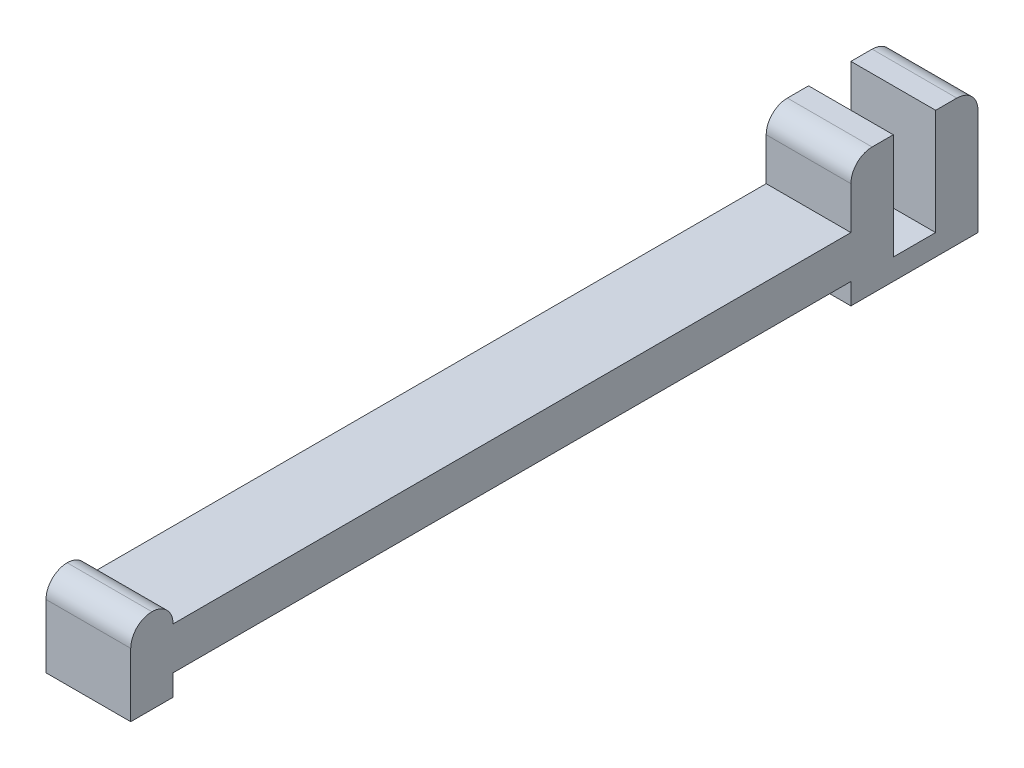
ISO-10303-21;
HEADER;
FILE_DESCRIPTION(('STEP AP214'),'2;1');
FILE_NAME('part.step','',(''),(''),'','','');
FILE_SCHEMA(('AUTOMOTIVE_DESIGN { 1 0 10303 214 1 1 1 1 }'));
ENDSEC;
DATA;
#1=APPLICATION_CONTEXT('core data for automotive mechanical design processes');
#2=APPLICATION_PROTOCOL_DEFINITION('international standard','automotive_design',2000,#1);
#3=PRODUCT_CONTEXT('',#1,'mechanical');
#4=PRODUCT('Part','Part','',(#3));
#5=PRODUCT_RELATED_PRODUCT_CATEGORY('part','',(#4));
#6=PRODUCT_DEFINITION_FORMATION('','',#4);
#7=PRODUCT_DEFINITION_CONTEXT('part definition',#1,'design');
#8=PRODUCT_DEFINITION('design','',#6,#7);
#9=PRODUCT_DEFINITION_SHAPE('','',#8);
#10=(LENGTH_UNIT() NAMED_UNIT(*) SI_UNIT(.MILLI.,.METRE.));
#11=(NAMED_UNIT(*) PLANE_ANGLE_UNIT() SI_UNIT($,.RADIAN.));
#12=(NAMED_UNIT(*) SI_UNIT($,.STERADIAN.) SOLID_ANGLE_UNIT());
#13=UNCERTAINTY_MEASURE_WITH_UNIT(LENGTH_MEASURE(1.E-05),#10,'distance_accuracy_value','');
#14=(GEOMETRIC_REPRESENTATION_CONTEXT(3) GLOBAL_UNCERTAINTY_ASSIGNED_CONTEXT((#13)) GLOBAL_UNIT_ASSIGNED_CONTEXT((#10,
#11,#12)) REPRESENTATION_CONTEXT('',''));
#15=CARTESIAN_POINT('',(0.,0.,0.));
#16=DIRECTION('',(0.,0.,1.));
#17=DIRECTION('',(1.,0.,0.));
#18=AXIS2_PLACEMENT_3D('',#15,#16,#17);
#19=CARTESIAN_POINT('',(40.,10.,-160.));
#20=DIRECTION('',(0.,-1.,0.));
#21=DIRECTION('',(0.,0.,-1.));
#22=AXIS2_PLACEMENT_3D('',#19,#20,#21);
#23=PLANE('',#22);
#24=DIRECTION('',(0.,0.,1.));
#25=VECTOR('',#24,1.);
#26=CARTESIAN_POINT('',(0.,10.,-160.));
#27=LINE('',#26,#25);
#28=CARTESIAN_POINT('',(0.,10.,-160.));
#29=VERTEX_POINT('',#28);
#30=CARTESIAN_POINT('',(0.,9.99999999999998,160.));
#31=VERTEX_POINT('',#30);
#32=EDGE_CURVE('E188',#29,#31,#27,.T.);
#33=ORIENTED_EDGE('',*,*,#32,.T.);
#34=DIRECTION('',(-1.,0.,0.));
#35=VECTOR('',#34,1.);
#36=CARTESIAN_POINT('',(40.,9.99999999999998,160.));
#37=LINE('',#36,#35);
#38=CARTESIAN_POINT('',(40.,9.99999999999998,160.));
#39=VERTEX_POINT('',#38);
#40=EDGE_CURVE('E186',#39,#31,#37,.T.);
#41=ORIENTED_EDGE('',*,*,#40,.F.);
#42=DIRECTION('',(0.,0.,1.));
#43=VECTOR('',#42,1.);
#44=CARTESIAN_POINT('',(40.,10.,-160.));
#45=LINE('',#44,#43);
#46=CARTESIAN_POINT('',(40.,10.,-160.));
#47=VERTEX_POINT('',#46);
#48=EDGE_CURVE('E168',#47,#39,#45,.T.);
#49=ORIENTED_EDGE('',*,*,#48,.F.);
#50=DIRECTION('',(-1.,0.,0.));
#51=VECTOR('',#50,1.);
#52=CARTESIAN_POINT('',(40.,10.,-160.));
#53=LINE('',#52,#51);
#54=EDGE_CURVE('E269',#47,#29,#53,.T.);
#55=ORIENTED_EDGE('',*,*,#54,.T.);
#56=EDGE_LOOP('',(#33,#41,#49,#55));
#57=FACE_BOUND('',#56,.T.);
#58=ADVANCED_FACE('F44',(#57),#23,.F.);
#59=CARTESIAN_POINT('',(40.,20.,180.));
#60=DIRECTION('',(0.,0.,-1.));
#61=DIRECTION('',(-1.,0.,0.));
#62=AXIS2_PLACEMENT_3D('',#59,#60,#61);
#63=PLANE('',#62);
#64=DIRECTION('',(0.,-1.,0.));
#65=VECTOR('',#64,1.);
#66=CARTESIAN_POINT('',(40.,20.,180.));
#67=LINE('',#66,#65);
#68=CARTESIAN_POINT('',(40.,9.99999999999998,180.));
#69=VERTEX_POINT('',#68);
#70=CARTESIAN_POINT('',(40.,-20.,180.));
#71=VERTEX_POINT('',#70);
#72=EDGE_CURVE('E181',#69,#71,#67,.T.);
#73=ORIENTED_EDGE('',*,*,#72,.F.);
#74=DIRECTION('',(-1.,0.,0.));
#75=VECTOR('',#74,1.);
#76=CARTESIAN_POINT('',(40.,9.99999999999998,180.));
#77=LINE('',#76,#75);
#78=CARTESIAN_POINT('',(0.,9.99999999999998,180.));
#79=VERTEX_POINT('',#78);
#80=EDGE_CURVE('E192',#69,#79,#77,.T.);
#81=ORIENTED_EDGE('',*,*,#80,.T.);
#82=DIRECTION('',(0.,-1.,0.));
#83=VECTOR('',#82,1.);
#84=CARTESIAN_POINT('',(0.,20.,180.));
#85=LINE('',#84,#83);
#86=CARTESIAN_POINT('',(0.,-20.,180.));
#87=VERTEX_POINT('',#86);
#88=EDGE_CURVE('E361',#79,#87,#85,.T.);
#89=ORIENTED_EDGE('',*,*,#88,.T.);
#90=DIRECTION('',(-1.,0.,0.));
#91=VECTOR('',#90,1.);
#92=CARTESIAN_POINT('',(40.,-20.,180.));
#93=LINE('',#92,#91);
#94=EDGE_CURVE('E193',#71,#87,#93,.T.);
#95=ORIENTED_EDGE('',*,*,#94,.F.);
#96=EDGE_LOOP('',(#73,#81,#89,#95));
#97=FACE_BOUND('',#96,.T.);
#98=ADVANCED_FACE('F320',(#97),#63,.F.);
#99=CARTESIAN_POINT('',(40.,-20.,180.));
#100=DIRECTION('',(0.,1.,0.));
#101=DIRECTION('',(0.,0.,1.));
#102=AXIS2_PLACEMENT_3D('',#99,#100,#101);
#103=PLANE('',#102);
#104=DIRECTION('',(0.,0.,-1.));
#105=VECTOR('',#104,1.);
#106=CARTESIAN_POINT('',(0.,-20.,180.));
#107=LINE('',#106,#105);
#108=CARTESIAN_POINT('',(0.,-20.,160.));
#109=VERTEX_POINT('',#108);
#110=EDGE_CURVE('E364',#87,#109,#107,.T.);
#111=ORIENTED_EDGE('',*,*,#110,.T.);
#112=DIRECTION('',(-1.,0.,0.));
#113=VECTOR('',#112,1.);
#114=CARTESIAN_POINT('',(40.,-20.,160.));
#115=LINE('',#114,#113);
#116=CARTESIAN_POINT('',(40.,-20.,160.));
#117=VERTEX_POINT('',#116);
#118=EDGE_CURVE('E303',#117,#109,#115,.T.);
#119=ORIENTED_EDGE('',*,*,#118,.F.);
#120=DIRECTION('',(0.,0.,-1.));
#121=VECTOR('',#120,1.);
#122=CARTESIAN_POINT('',(40.,-20.,180.));
#123=LINE('',#122,#121);
#124=EDGE_CURVE('E323',#71,#117,#123,.T.);
#125=ORIENTED_EDGE('',*,*,#124,.F.);
#126=ORIENTED_EDGE('',*,*,#94,.T.);
#127=EDGE_LOOP('',(#111,#119,#125,#126));
#128=FACE_BOUND('',#127,.T.);
#129=ADVANCED_FACE('F396',(#128),#103,.F.);
#130=CARTESIAN_POINT('',(40.,-20.,160.));
#131=DIRECTION('',(0.,0.,1.));
#132=DIRECTION('',(0.,-1.,0.));
#133=AXIS2_PLACEMENT_3D('',#130,#131,#132);
#134=PLANE('',#133);
#135=DIRECTION('',(0.,1.,0.));
#136=VECTOR('',#135,1.);
#137=CARTESIAN_POINT('',(0.,-20.,160.));
#138=LINE('',#137,#136);
#139=CARTESIAN_POINT('',(0.,-10.,160.));
#140=VERTEX_POINT('',#139);
#141=EDGE_CURVE('E367',#109,#140,#138,.T.);
#142=ORIENTED_EDGE('',*,*,#141,.T.);
#143=DIRECTION('',(-1.,0.,0.));
#144=VECTOR('',#143,1.);
#145=CARTESIAN_POINT('',(40.,-10.,160.));
#146=LINE('',#145,#144);
#147=CARTESIAN_POINT('',(40.,-10.,160.));
#148=VERTEX_POINT('',#147);
#149=EDGE_CURVE('E299',#148,#140,#146,.T.);
#150=ORIENTED_EDGE('',*,*,#149,.F.);
#151=DIRECTION('',(0.,1.,0.));
#152=VECTOR('',#151,1.);
#153=CARTESIAN_POINT('',(40.,-20.,160.));
#154=LINE('',#153,#152);
#155=EDGE_CURVE('E326',#117,#148,#154,.T.);
#156=ORIENTED_EDGE('',*,*,#155,.F.);
#157=ORIENTED_EDGE('',*,*,#118,.T.);
#158=EDGE_LOOP('',(#142,#150,#156,#157));
#159=FACE_BOUND('',#158,.T.);
#160=ADVANCED_FACE('F444',(#159),#134,.F.);
#161=CARTESIAN_POINT('',(40.,-9.99999999999998,-160.));
#162=DIRECTION('',(0.,1.,0.));
#163=DIRECTION('',(0.,0.,1.));
#164=AXIS2_PLACEMENT_3D('',#161,#162,#163);
#165=PLANE('',#164);
#166=DIRECTION('',(0.,0.,-1.));
#167=VECTOR('',#166,1.);
#168=CARTESIAN_POINT('',(0.,-9.99999999999998,-160.));
#169=LINE('',#168,#167);
#170=CARTESIAN_POINT('',(0.,-9.99999999999998,-160.));
#171=VERTEX_POINT('',#170);
#172=EDGE_CURVE('E370',#140,#171,#169,.T.);
#173=ORIENTED_EDGE('',*,*,#172,.T.);
#174=DIRECTION('',(-1.,0.,0.));
#175=VECTOR('',#174,1.);
#176=CARTESIAN_POINT('',(40.,-9.99999999999998,-160.));
#177=LINE('',#176,#175);
#178=CARTESIAN_POINT('',(40.,-9.99999999999998,-160.));
#179=VERTEX_POINT('',#178);
#180=EDGE_CURVE('E295',#179,#171,#177,.T.);
#181=ORIENTED_EDGE('',*,*,#180,.F.);
#182=DIRECTION('',(0.,0.,-1.));
#183=VECTOR('',#182,1.);
#184=CARTESIAN_POINT('',(40.,-9.99999999999998,-160.));
#185=LINE('',#184,#183);
#186=EDGE_CURVE('E331',#148,#179,#185,.T.);
#187=ORIENTED_EDGE('',*,*,#186,.F.);
#188=ORIENTED_EDGE('',*,*,#149,.T.);
#189=EDGE_LOOP('',(#173,#181,#187,#188));
#190=FACE_BOUND('',#189,.T.);
#191=ADVANCED_FACE('F440',(#190),#165,.F.);
#192=CARTESIAN_POINT('',(40.,-20.,-160.));
#193=DIRECTION('',(0.,0.,-1.));
#194=DIRECTION('',(-1.,0.,0.));
#195=AXIS2_PLACEMENT_3D('',#192,#193,#194);
#196=PLANE('',#195);
#197=DIRECTION('',(0.,-1.,0.));
#198=VECTOR('',#197,1.);
#199=CARTESIAN_POINT('',(0.,-20.,-160.));
#200=LINE('',#199,#198);
#201=CARTESIAN_POINT('',(0.,-20.,-160.));
#202=VERTEX_POINT('',#201);
#203=EDGE_CURVE('E373',#171,#202,#200,.T.);
#204=ORIENTED_EDGE('',*,*,#203,.T.);
#205=DIRECTION('',(-1.,0.,0.));
#206=VECTOR('',#205,1.);
#207=CARTESIAN_POINT('',(40.,-20.,-160.));
#208=LINE('',#207,#206);
#209=CARTESIAN_POINT('',(40.,-20.,-160.));
#210=VERTEX_POINT('',#209);
#211=EDGE_CURVE('E291',#210,#202,#208,.T.);
#212=ORIENTED_EDGE('',*,*,#211,.F.);
#213=DIRECTION('',(0.,-1.,0.));
#214=VECTOR('',#213,1.);
#215=CARTESIAN_POINT('',(40.,-20.,-160.));
#216=LINE('',#215,#214);
#217=EDGE_CURVE('E334',#179,#210,#216,.T.);
#218=ORIENTED_EDGE('',*,*,#217,.F.);
#219=ORIENTED_EDGE('',*,*,#180,.T.);
#220=EDGE_LOOP('',(#204,#212,#218,#219));
#221=FACE_BOUND('',#220,.T.);
#222=ADVANCED_FACE('F437',(#221),#196,.F.);
#223=CARTESIAN_POINT('',(40.,-20.,-180.));
#224=DIRECTION('',(0.,1.,0.));
#225=DIRECTION('',(0.,0.,1.));
#226=AXIS2_PLACEMENT_3D('',#223,#224,#225);
#227=PLANE('',#226);
#228=DIRECTION('',(0.,0.,-1.));
#229=VECTOR('',#228,1.);
#230=CARTESIAN_POINT('',(0.,-20.,-180.));
#231=LINE('',#230,#229);
#232=CARTESIAN_POINT('',(0.,-20.,-220.));
#233=VERTEX_POINT('',#232);
#234=EDGE_CURVE('E254',#202,#233,#231,.T.);
#235=ORIENTED_EDGE('',*,*,#234,.T.);
#236=DIRECTION('',(-1.,0.,0.));
#237=VECTOR('',#236,1.);
#238=CARTESIAN_POINT('',(40.,-20.,-220.));
#239=LINE('',#238,#237);
#240=CARTESIAN_POINT('',(40.,-20.,-220.));
#241=VERTEX_POINT('',#240);
#242=EDGE_CURVE('E287',#241,#233,#239,.T.);
#243=ORIENTED_EDGE('',*,*,#242,.F.);
#244=DIRECTION('',(0.,0.,-1.));
#245=VECTOR('',#244,1.);
#246=CARTESIAN_POINT('',(40.,-20.,-180.));
#247=LINE('',#246,#245);
#248=EDGE_CURVE('E337',#210,#241,#247,.T.);
#249=ORIENTED_EDGE('',*,*,#248,.F.);
#250=ORIENTED_EDGE('',*,*,#211,.T.);
#251=EDGE_LOOP('',(#235,#243,#249,#250));
#252=FACE_BOUND('',#251,.T.);
#253=ADVANCED_FACE('F379',(#252),#227,.F.);
#254=CARTESIAN_POINT('',(40.,-20.,-220.));
#255=DIRECTION('',(0.,0.,1.));
#256=DIRECTION('',(1.,0.,0.));
#257=AXIS2_PLACEMENT_3D('',#254,#255,#256);
#258=PLANE('',#257);
#259=DIRECTION('',(0.,1.,0.));
#260=VECTOR('',#259,1.);
#261=CARTESIAN_POINT('',(0.,-20.,-220.));
#262=LINE('',#261,#260);
#263=CARTESIAN_POINT('',(0.,30.,-220.));
#264=VERTEX_POINT('',#263);
#265=EDGE_CURVE('E248',#233,#264,#262,.T.);
#266=ORIENTED_EDGE('',*,*,#265,.T.);
#267=DIRECTION('',(-1.,0.,0.));
#268=VECTOR('',#267,1.);
#269=CARTESIAN_POINT('',(40.,30.,-220.));
#270=LINE('',#269,#268);
#271=CARTESIAN_POINT('',(40.,30.,-220.));
#272=VERTEX_POINT('',#271);
#273=EDGE_CURVE('E11',#264,#272,#270,.F.);
#274=ORIENTED_EDGE('',*,*,#273,.T.);
#275=DIRECTION('',(0.,1.,0.));
#276=VECTOR('',#275,1.);
#277=CARTESIAN_POINT('',(40.,-20.,-220.));
#278=LINE('',#277,#276);
#279=EDGE_CURVE('E340',#241,#272,#278,.T.);
#280=ORIENTED_EDGE('',*,*,#279,.F.);
#281=ORIENTED_EDGE('',*,*,#242,.T.);
#282=EDGE_LOOP('',(#266,#274,#280,#281));
#283=FACE_BOUND('',#282,.T.);
#284=ADVANCED_FACE('F383',(#283),#258,.F.);
#285=CARTESIAN_POINT('',(40.,40.,-200.));
#286=DIRECTION('',(0.,-1.,0.));
#287=DIRECTION('',(0.,0.,-1.));
#288=AXIS2_PLACEMENT_3D('',#285,#286,#287);
#289=PLANE('',#288);
#290=DIRECTION('',(0.,0.,1.));
#291=VECTOR('',#290,1.);
#292=CARTESIAN_POINT('',(40.,40.,-200.));
#293=LINE('',#292,#291);
#294=CARTESIAN_POINT('',(40.,40.,-210.));
#295=VERTEX_POINT('',#294);
#296=CARTESIAN_POINT('',(40.,40.,-200.));
#297=VERTEX_POINT('',#296);
#298=EDGE_CURVE('E238',#295,#297,#293,.T.);
#299=ORIENTED_EDGE('',*,*,#298,.F.);
#300=DIRECTION('',(-1.,0.,0.));
#301=VECTOR('',#300,1.);
#302=CARTESIAN_POINT('',(40.,40.,-210.));
#303=LINE('',#302,#301);
#304=CARTESIAN_POINT('',(0.,40.,-210.));
#305=VERTEX_POINT('',#304);
#306=EDGE_CURVE('E53',#295,#305,#303,.T.);
#307=ORIENTED_EDGE('',*,*,#306,.T.);
#308=DIRECTION('',(0.,0.,1.));
#309=VECTOR('',#308,1.);
#310=CARTESIAN_POINT('',(0.,40.,-200.));
#311=LINE('',#310,#309);
#312=CARTESIAN_POINT('',(0.,40.,-200.));
#313=VERTEX_POINT('',#312);
#314=EDGE_CURVE('E236',#305,#313,#311,.T.);
#315=ORIENTED_EDGE('',*,*,#314,.T.);
#316=DIRECTION('',(-1.,0.,0.));
#317=VECTOR('',#316,1.);
#318=CARTESIAN_POINT('',(40.,40.,-200.));
#319=LINE('',#318,#317);
#320=EDGE_CURVE('E284',#297,#313,#319,.T.);
#321=ORIENTED_EDGE('',*,*,#320,.F.);
#322=EDGE_LOOP('',(#299,#307,#315,#321));
#323=FACE_BOUND('',#322,.T.);
#324=ADVANCED_FACE('F234',(#323),#289,.F.);
#325=CARTESIAN_POINT('',(40.,-9.99999999999998,-200.));
#326=DIRECTION('',(0.,0.,-1.));
#327=DIRECTION('',(-1.,0.,0.));
#328=AXIS2_PLACEMENT_3D('',#325,#326,#327);
#329=PLANE('',#328);
#330=DIRECTION('',(0.,-1.,0.));
#331=VECTOR('',#330,1.);
#332=CARTESIAN_POINT('',(0.,-9.99999999999998,-200.));
#333=LINE('',#332,#331);
#334=CARTESIAN_POINT('',(0.,-9.99999999999998,-200.));
#335=VERTEX_POINT('',#334);
#336=EDGE_CURVE('E246',#313,#335,#333,.T.);
#337=ORIENTED_EDGE('',*,*,#336,.T.);
#338=DIRECTION('',(-1.,0.,0.));
#339=VECTOR('',#338,1.);
#340=CARTESIAN_POINT('',(40.,-9.99999999999998,-200.));
#341=LINE('',#340,#339);
#342=CARTESIAN_POINT('',(40.,-9.99999999999998,-200.));
#343=VERTEX_POINT('',#342);
#344=EDGE_CURVE('E280',#343,#335,#341,.T.);
#345=ORIENTED_EDGE('',*,*,#344,.F.);
#346=DIRECTION('',(0.,-1.,0.));
#347=VECTOR('',#346,1.);
#348=CARTESIAN_POINT('',(40.,-9.99999999999998,-200.));
#349=LINE('',#348,#347);
#350=EDGE_CURVE('E345',#297,#343,#349,.T.);
#351=ORIENTED_EDGE('',*,*,#350,.F.);
#352=ORIENTED_EDGE('',*,*,#320,.T.);
#353=EDGE_LOOP('',(#337,#345,#351,#352));
#354=FACE_BOUND('',#353,.T.);
#355=ADVANCED_FACE('F426',(#354),#329,.F.);
#356=CARTESIAN_POINT('',(40.,-9.99999999999998,-180.));
#357=DIRECTION('',(0.,-1.,0.));
#358=DIRECTION('',(0.,0.,-1.));
#359=AXIS2_PLACEMENT_3D('',#356,#357,#358);
#360=PLANE('',#359);
#361=DIRECTION('',(0.,0.,1.));
#362=VECTOR('',#361,1.);
#363=CARTESIAN_POINT('',(0.,-9.99999999999998,-180.));
#364=LINE('',#363,#362);
#365=CARTESIAN_POINT('',(0.,-9.99999999999998,-180.));
#366=VERTEX_POINT('',#365);
#367=EDGE_CURVE('E252',#335,#366,#364,.T.);
#368=ORIENTED_EDGE('',*,*,#367,.T.);
#369=DIRECTION('',(-1.,0.,0.));
#370=VECTOR('',#369,1.);
#371=CARTESIAN_POINT('',(40.,-9.99999999999998,-180.));
#372=LINE('',#371,#370);
#373=CARTESIAN_POINT('',(40.,-9.99999999999998,-180.));
#374=VERTEX_POINT('',#373);
#375=EDGE_CURVE('E276',#374,#366,#372,.T.);
#376=ORIENTED_EDGE('',*,*,#375,.F.);
#377=DIRECTION('',(0.,0.,1.));
#378=VECTOR('',#377,1.);
#379=CARTESIAN_POINT('',(40.,-9.99999999999998,-180.));
#380=LINE('',#379,#378);
#381=EDGE_CURVE('E348',#343,#374,#380,.T.);
#382=ORIENTED_EDGE('',*,*,#381,.F.);
#383=ORIENTED_EDGE('',*,*,#344,.T.);
#384=EDGE_LOOP('',(#368,#376,#382,#383));
#385=FACE_BOUND('',#384,.T.);
#386=ADVANCED_FACE('F422',(#385),#360,.F.);
#387=CARTESIAN_POINT('',(40.,40.,-180.));
#388=DIRECTION('',(0.,0.,1.));
#389=DIRECTION('',(1.,0.,0.));
#390=AXIS2_PLACEMENT_3D('',#387,#388,#389);
#391=PLANE('',#390);
#392=DIRECTION('',(0.,1.,0.));
#393=VECTOR('',#392,1.);
#394=CARTESIAN_POINT('',(0.,40.,-180.));
#395=LINE('',#394,#393);
#396=CARTESIAN_POINT('',(0.,40.,-180.));
#397=VERTEX_POINT('',#396);
#398=EDGE_CURVE('E260',#366,#397,#395,.T.);
#399=ORIENTED_EDGE('',*,*,#398,.T.);
#400=DIRECTION('',(-1.,0.,0.));
#401=VECTOR('',#400,1.);
#402=CARTESIAN_POINT('',(40.,40.,-180.));
#403=LINE('',#402,#401);
#404=CARTESIAN_POINT('',(40.,40.,-180.));
#405=VERTEX_POINT('',#404);
#406=EDGE_CURVE('E272',#405,#397,#403,.T.);
#407=ORIENTED_EDGE('',*,*,#406,.F.);
#408=DIRECTION('',(0.,1.,0.));
#409=VECTOR('',#408,1.);
#410=CARTESIAN_POINT('',(40.,40.,-180.));
#411=LINE('',#410,#409);
#412=EDGE_CURVE('E351',#374,#405,#411,.T.);
#413=ORIENTED_EDGE('',*,*,#412,.F.);
#414=ORIENTED_EDGE('',*,*,#375,.T.);
#415=EDGE_LOOP('',(#399,#407,#413,#414));
#416=FACE_BOUND('',#415,.T.);
#417=ADVANCED_FACE('F419',(#416),#391,.F.);
#418=CARTESIAN_POINT('',(40.,40.,-160.));
#419=DIRECTION('',(0.,-1.,0.));
#420=DIRECTION('',(0.,0.,-1.));
#421=AXIS2_PLACEMENT_3D('',#418,#419,#420);
#422=PLANE('',#421);
#423=DIRECTION('',(0.,0.,1.));
#424=VECTOR('',#423,1.);
#425=CARTESIAN_POINT('',(0.,40.,-160.));
#426=LINE('',#425,#424);
#427=CARTESIAN_POINT('',(0.,40.,-170.));
#428=VERTEX_POINT('',#427);
#429=EDGE_CURVE('E263',#397,#428,#426,.T.);
#430=ORIENTED_EDGE('',*,*,#429,.T.);
#431=DIRECTION('',(-1.,0.,0.));
#432=VECTOR('',#431,1.);
#433=CARTESIAN_POINT('',(40.,40.,-170.));
#434=LINE('',#433,#432);
#435=CARTESIAN_POINT('',(40.,40.,-170.));
#436=VERTEX_POINT('',#435);
#437=EDGE_CURVE('E222',#428,#436,#434,.F.);
#438=ORIENTED_EDGE('',*,*,#437,.T.);
#439=DIRECTION('',(0.,0.,1.));
#440=VECTOR('',#439,1.);
#441=CARTESIAN_POINT('',(40.,40.,-160.));
#442=LINE('',#441,#440);
#443=EDGE_CURVE('E354',#405,#436,#442,.T.);
#444=ORIENTED_EDGE('',*,*,#443,.F.);
#445=ORIENTED_EDGE('',*,*,#406,.T.);
#446=EDGE_LOOP('',(#430,#438,#444,#445));
#447=FACE_BOUND('',#446,.T.);
#448=ADVANCED_FACE('F415',(#447),#422,.F.);
#449=CARTESIAN_POINT('',(40.,10.,-160.));
#450=DIRECTION('',(0.,0.,-1.));
#451=DIRECTION('',(-1.,0.,0.));
#452=AXIS2_PLACEMENT_3D('',#449,#450,#451);
#453=PLANE('',#452);
#454=DIRECTION('',(0.,-1.,0.));
#455=VECTOR('',#454,1.);
#456=CARTESIAN_POINT('',(40.,10.,-160.));
#457=LINE('',#456,#455);
#458=CARTESIAN_POINT('',(40.,30.,-160.));
#459=VERTEX_POINT('',#458);
#460=EDGE_CURVE('E176',#459,#47,#457,.T.);
#461=ORIENTED_EDGE('',*,*,#460,.F.);
#462=DIRECTION('',(-1.,0.,0.));
#463=VECTOR('',#462,1.);
#464=CARTESIAN_POINT('',(40.,30.,-160.));
#465=LINE('',#464,#463);
#466=CARTESIAN_POINT('',(0.,30.,-160.));
#467=VERTEX_POINT('',#466);
#468=EDGE_CURVE('E205',#459,#467,#465,.T.);
#469=ORIENTED_EDGE('',*,*,#468,.T.);
#470=DIRECTION('',(0.,-1.,0.));
#471=VECTOR('',#470,1.);
#472=CARTESIAN_POINT('',(0.,10.,-160.));
#473=LINE('',#472,#471);
#474=EDGE_CURVE('E182',#467,#29,#473,.T.);
#475=ORIENTED_EDGE('',*,*,#474,.T.);
#476=ORIENTED_EDGE('',*,*,#54,.F.);
#477=EDGE_LOOP('',(#461,#469,#475,#476));
#478=FACE_BOUND('',#477,.T.);
#479=ADVANCED_FACE('F410',(#478),#453,.F.);
#480=CARTESIAN_POINT('',(40.,0.,0.));
#481=DIRECTION('',(-1.,0.,0.));
#482=DIRECTION('',(0.,0.,1.));
#483=AXIS2_PLACEMENT_3D('',#480,#481,#482);
#484=PLANE('',#483);
#485=ORIENTED_EDGE('',*,*,#443,.T.);
#486=CARTESIAN_POINT('',(40.,30.,-170.));
#487=DIRECTION('',(-1.,0.,0.));
#488=DIRECTION('',(0.,0.,1.));
#489=AXIS2_PLACEMENT_3D('',#486,#487,#488);
#490=CIRCLE('',#489,10.);
#491=EDGE_CURVE('E227',#436,#459,#490,.F.);
#492=ORIENTED_EDGE('',*,*,#491,.T.);
#493=ORIENTED_EDGE('',*,*,#460,.T.);
#494=ORIENTED_EDGE('',*,*,#48,.T.);
#495=CARTESIAN_POINT('',(40.,9.99999999999998,170.));
#496=DIRECTION('',(-1.,0.,0.));
#497=DIRECTION('',(0.,0.,1.));
#498=AXIS2_PLACEMENT_3D('',#495,#496,#497);
#499=CIRCLE('',#498,10.);
#500=CARTESIAN_POINT('',(40.,20.,170.));
#501=VERTEX_POINT('',#500);
#502=EDGE_CURVE('E173',#39,#501,#499,.F.);
#503=ORIENTED_EDGE('',*,*,#502,.T.);
#504=CARTESIAN_POINT('',(40.,9.99999999999998,170.));
#505=DIRECTION('',(-1.,0.,0.));
#506=DIRECTION('',(0.,0.,1.));
#507=AXIS2_PLACEMENT_3D('',#504,#505,#506);
#508=CIRCLE('',#507,10.);
#509=EDGE_CURVE('E200',#501,#69,#508,.F.);
#510=ORIENTED_EDGE('',*,*,#509,.T.);
#511=ORIENTED_EDGE('',*,*,#72,.T.);
#512=ORIENTED_EDGE('',*,*,#124,.T.);
#513=ORIENTED_EDGE('',*,*,#155,.T.);
#514=ORIENTED_EDGE('',*,*,#186,.T.);
#515=ORIENTED_EDGE('',*,*,#217,.T.);
#516=ORIENTED_EDGE('',*,*,#248,.T.);
#517=ORIENTED_EDGE('',*,*,#279,.T.);
#518=CARTESIAN_POINT('',(40.,30.,-210.));
#519=DIRECTION('',(-1.,0.,0.));
#520=DIRECTION('',(0.,0.,1.));
#521=AXIS2_PLACEMENT_3D('',#518,#519,#520);
#522=CIRCLE('',#521,10.);
#523=EDGE_CURVE('E60',#272,#295,#522,.F.);
#524=ORIENTED_EDGE('',*,*,#523,.T.);
#525=ORIENTED_EDGE('',*,*,#298,.T.);
#526=ORIENTED_EDGE('',*,*,#350,.T.);
#527=ORIENTED_EDGE('',*,*,#381,.T.);
#528=ORIENTED_EDGE('',*,*,#412,.T.);
#529=EDGE_LOOP('',(#485,#492,#493,#494,#503,#510,#511,#512,#513,#514,#515,#516,#517,#524,#525,
#526,#527,#528));
#530=FACE_BOUND('',#529,.T.);
#531=ADVANCED_FACE('F171',(#530),#484,.F.);
#532=CARTESIAN_POINT('',(0.,0.,0.));
#533=DIRECTION('',(-1.,0.,0.));
#534=DIRECTION('',(0.,0.,1.));
#535=AXIS2_PLACEMENT_3D('',#532,#533,#534);
#536=PLANE('',#535);
#537=ORIENTED_EDGE('',*,*,#474,.F.);
#538=CARTESIAN_POINT('',(0.,30.,-170.));
#539=DIRECTION('',(-1.,0.,0.));
#540=DIRECTION('',(0.,0.,1.));
#541=AXIS2_PLACEMENT_3D('',#538,#539,#540);
#542=CIRCLE('',#541,10.);
#543=EDGE_CURVE('E219',#467,#428,#542,.T.);
#544=ORIENTED_EDGE('',*,*,#543,.T.);
#545=ORIENTED_EDGE('',*,*,#429,.F.);
#546=ORIENTED_EDGE('',*,*,#398,.F.);
#547=ORIENTED_EDGE('',*,*,#367,.F.);
#548=ORIENTED_EDGE('',*,*,#336,.F.);
#549=ORIENTED_EDGE('',*,*,#314,.F.);
#550=CARTESIAN_POINT('',(0.,30.,-210.));
#551=DIRECTION('',(-1.,0.,0.));
#552=DIRECTION('',(0.,0.,1.));
#553=AXIS2_PLACEMENT_3D('',#550,#551,#552);
#554=CIRCLE('',#553,10.);
#555=EDGE_CURVE('E216',#305,#264,#554,.T.);
#556=ORIENTED_EDGE('',*,*,#555,.T.);
#557=ORIENTED_EDGE('',*,*,#265,.F.);
#558=ORIENTED_EDGE('',*,*,#234,.F.);
#559=ORIENTED_EDGE('',*,*,#203,.F.);
#560=ORIENTED_EDGE('',*,*,#172,.F.);
#561=ORIENTED_EDGE('',*,*,#141,.F.);
#562=ORIENTED_EDGE('',*,*,#110,.F.);
#563=ORIENTED_EDGE('',*,*,#88,.F.);
#564=CARTESIAN_POINT('',(0.,9.99999999999998,170.));
#565=DIRECTION('',(-1.,0.,0.));
#566=DIRECTION('',(0.,0.,1.));
#567=AXIS2_PLACEMENT_3D('',#564,#565,#566);
#568=CIRCLE('',#567,10.);
#569=CARTESIAN_POINT('',(0.,20.,170.));
#570=VERTEX_POINT('',#569);
#571=EDGE_CURVE('E201',#79,#570,#568,.T.);
#572=ORIENTED_EDGE('',*,*,#571,.T.);
#573=CARTESIAN_POINT('',(0.,9.99999999999998,170.));
#574=DIRECTION('',(-1.,0.,0.));
#575=DIRECTION('',(0.,0.,1.));
#576=AXIS2_PLACEMENT_3D('',#573,#574,#575);
#577=CIRCLE('',#576,10.);
#578=EDGE_CURVE('E207',#570,#31,#577,.T.);
#579=ORIENTED_EDGE('',*,*,#578,.T.);
#580=ORIENTED_EDGE('',*,*,#32,.F.);
#581=EDGE_LOOP('',(#537,#544,#545,#546,#547,#548,#549,#556,#557,#558,#559,#560,#561,#562,#563,
#572,#579,#580));
#582=FACE_BOUND('',#581,.T.);
#583=ADVANCED_FACE('F243',(#582),#536,.T.);
#584=CARTESIAN_POINT('',(40.,9.99999999999998,170.));
#585=DIRECTION('',(-1.,0.,0.));
#586=DIRECTION('',(0.,0.,1.));
#587=AXIS2_PLACEMENT_3D('',#584,#585,#586);
#588=CYLINDRICAL_SURFACE('',#587,10.);
#589=DIRECTION('',(-1.,0.,0.));
#590=VECTOR('',#589,1.);
#591=CARTESIAN_POINT('',(40.,20.,170.));
#592=LINE('',#591,#590);
#593=EDGE_CURVE('E197',#501,#570,#592,.T.);
#594=ORIENTED_EDGE('',*,*,#593,.F.);
#595=ORIENTED_EDGE('',*,*,#502,.F.);
#596=ORIENTED_EDGE('',*,*,#40,.T.);
#597=ORIENTED_EDGE('',*,*,#578,.F.);
#598=EDGE_LOOP('',(#594,#595,#596,#597));
#599=FACE_BOUND('',#598,.T.);
#600=ADVANCED_FACE('F195',(#599),#588,.T.);
#601=CARTESIAN_POINT('',(40.,9.99999999999998,170.));
#602=DIRECTION('',(-1.,0.,0.));
#603=DIRECTION('',(0.,0.,1.));
#604=AXIS2_PLACEMENT_3D('',#601,#602,#603);
#605=CYLINDRICAL_SURFACE('',#604,10.);
#606=ORIENTED_EDGE('',*,*,#509,.F.);
#607=ORIENTED_EDGE('',*,*,#593,.T.);
#608=ORIENTED_EDGE('',*,*,#571,.F.);
#609=ORIENTED_EDGE('',*,*,#80,.F.);
#610=EDGE_LOOP('',(#606,#607,#608,#609));
#611=FACE_BOUND('',#610,.T.);
#612=ADVANCED_FACE('F315',(#611),#605,.T.);
#613=CARTESIAN_POINT('',(40.,30.,-170.));
#614=DIRECTION('',(-1.,0.,0.));
#615=DIRECTION('',(0.,0.,1.));
#616=AXIS2_PLACEMENT_3D('',#613,#614,#615);
#617=CYLINDRICAL_SURFACE('',#616,10.);
#618=ORIENTED_EDGE('',*,*,#491,.F.);
#619=ORIENTED_EDGE('',*,*,#437,.F.);
#620=ORIENTED_EDGE('',*,*,#543,.F.);
#621=ORIENTED_EDGE('',*,*,#468,.F.);
#622=EDGE_LOOP('',(#618,#619,#620,#621));
#623=FACE_BOUND('',#622,.T.);
#624=ADVANCED_FACE('F385',(#623),#617,.T.);
#625=CARTESIAN_POINT('',(40.,30.,-210.));
#626=DIRECTION('',(-1.,0.,0.));
#627=DIRECTION('',(0.,0.,1.));
#628=AXIS2_PLACEMENT_3D('',#625,#626,#627);
#629=CYLINDRICAL_SURFACE('',#628,10.);
#630=ORIENTED_EDGE('',*,*,#523,.F.);
#631=ORIENTED_EDGE('',*,*,#273,.F.);
#632=ORIENTED_EDGE('',*,*,#555,.F.);
#633=ORIENTED_EDGE('',*,*,#306,.F.);
#634=EDGE_LOOP('',(#630,#631,#632,#633));
#635=FACE_BOUND('',#634,.T.);
#636=ADVANCED_FACE('F46',(#635),#629,.T.);
#637=CLOSED_SHELL('',(#58,#98,#129,#160,#191,#222,#253,#284,#324,#355,#386,#417,#448,#479,#531,
#583,#600,#612,#624,#636));
#638=MANIFOLD_SOLID_BREP('B2',#637);
#639=ADVANCED_BREP_SHAPE_REPRESENTATION('',(#18,#638),#14);
#640=SHAPE_DEFINITION_REPRESENTATION(#9,#639);
ENDSEC;
END-ISO-10303-21;
